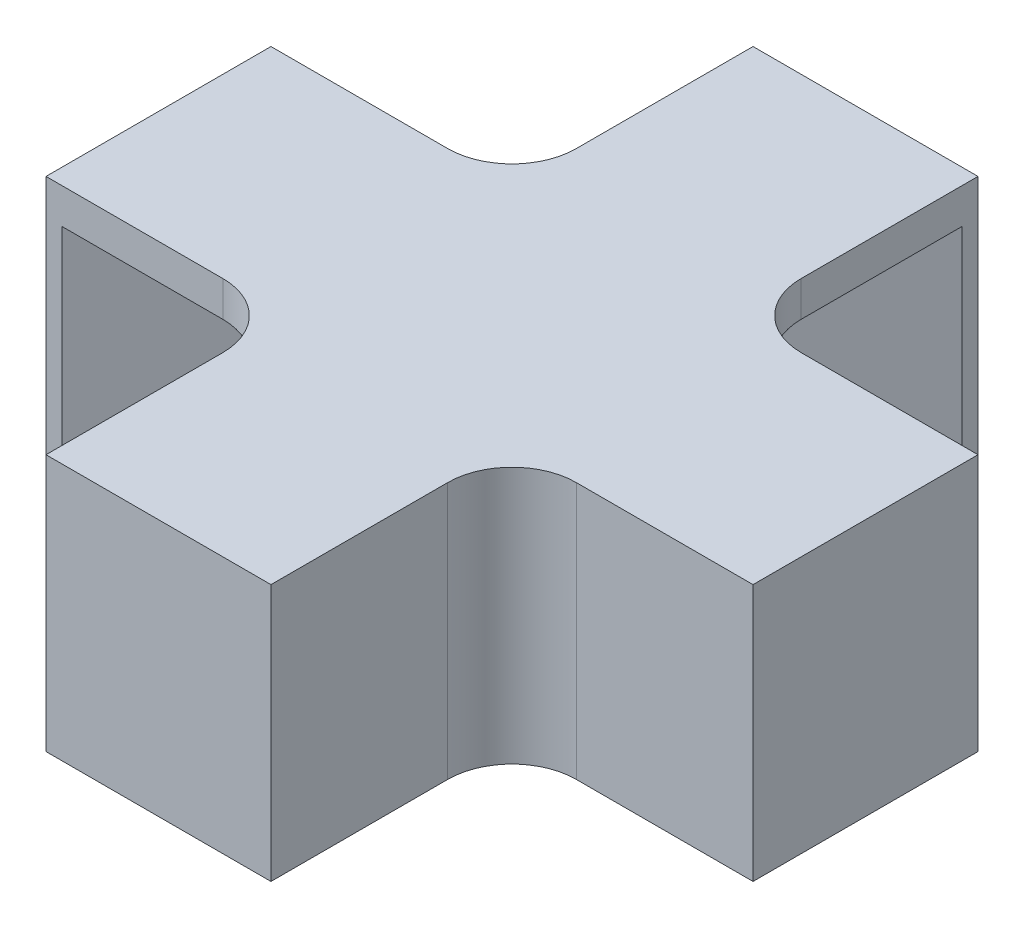
ISO-10303-21;
HEADER;
FILE_DESCRIPTION(('STEP AP214'),'2;1');
FILE_NAME('part.step','',(''),(''),'','','');
FILE_SCHEMA(('AUTOMOTIVE_DESIGN { 1 0 10303 214 1 1 1 1 }'));
ENDSEC;
DATA;
#1=APPLICATION_CONTEXT('core data for automotive mechanical design processes');
#2=APPLICATION_PROTOCOL_DEFINITION('international standard','automotive_design',2000,#1);
#3=PRODUCT_CONTEXT('',#1,'mechanical');
#4=PRODUCT('Part','Part','',(#3));
#5=PRODUCT_RELATED_PRODUCT_CATEGORY('part','',(#4));
#6=PRODUCT_DEFINITION_FORMATION('','',#4);
#7=PRODUCT_DEFINITION_CONTEXT('part definition',#1,'design');
#8=PRODUCT_DEFINITION('design','',#6,#7);
#9=PRODUCT_DEFINITION_SHAPE('','',#8);
#10=(LENGTH_UNIT() NAMED_UNIT(*) SI_UNIT(.MILLI.,.METRE.));
#11=(NAMED_UNIT(*) PLANE_ANGLE_UNIT() SI_UNIT($,.RADIAN.));
#12=(NAMED_UNIT(*) SI_UNIT($,.STERADIAN.) SOLID_ANGLE_UNIT());
#13=UNCERTAINTY_MEASURE_WITH_UNIT(LENGTH_MEASURE(1.E-05),#10,'distance_accuracy_value','');
#14=(GEOMETRIC_REPRESENTATION_CONTEXT(3) GLOBAL_UNCERTAINTY_ASSIGNED_CONTEXT((#13)) GLOBAL_UNIT_ASSIGNED_CONTEXT((#10,
#11,#12)) REPRESENTATION_CONTEXT('',''));
#15=CARTESIAN_POINT('',(0.,0.,0.));
#16=DIRECTION('',(0.,0.,1.));
#17=DIRECTION('',(1.,0.,0.));
#18=AXIS2_PLACEMENT_3D('',#15,#16,#17);
#19=CARTESIAN_POINT('',(-35.1963565550312,40.,0.));
#20=DIRECTION('',(1.,0.,0.));
#21=DIRECTION('',(0.,0.,-1.));
#22=AXIS2_PLACEMENT_3D('',#19,#20,#21);
#23=PLANE('',#22);
#24=DIRECTION('',(0.,0.,1.));
#25=VECTOR('',#24,1.);
#26=CARTESIAN_POINT('',(-35.1963565550312,34.5,0.));
#27=LINE('',#26,#25);
#28=CARTESIAN_POINT('',(-35.1963565550312,34.5,-65.3254131006446));
#29=VERTEX_POINT('',#28);
#30=CARTESIAN_POINT('',(-35.1963565550312,34.5,-40.3236274319105));
#31=VERTEX_POINT('',#30);
#32=EDGE_CURVE('E372',#29,#31,#27,.T.);
#33=ORIENTED_EDGE('',*,*,#32,.F.);
#34=DIRECTION('',(0.,-1.,0.));
#35=VECTOR('',#34,1.);
#36=CARTESIAN_POINT('',(-35.1963565550312,34.5,-65.3254131006446));
#37=LINE('',#36,#35);
#38=CARTESIAN_POINT('',(-35.1963565550312,0.,-65.3254131006446));
#39=VERTEX_POINT('',#38);
#40=EDGE_CURVE('E365',#29,#39,#37,.T.);
#41=ORIENTED_EDGE('',*,*,#40,.T.);
#42=DIRECTION('',(0.,0.,1.));
#43=VECTOR('',#42,1.);
#44=CARTESIAN_POINT('',(-35.1963565550312,0.,0.));
#45=LINE('',#44,#43);
#46=CARTESIAN_POINT('',(-35.1963565550312,0.,-67.8236274319104));
#47=VERTEX_POINT('',#46);
#48=EDGE_CURVE('E214',#47,#39,#45,.T.);
#49=ORIENTED_EDGE('',*,*,#48,.F.);
#50=DIRECTION('',(0.,-1.,0.));
#51=VECTOR('',#50,1.);
#52=CARTESIAN_POINT('',(-35.1963565550312,40.,-67.8236274319104));
#53=LINE('',#52,#51);
#54=CARTESIAN_POINT('',(-35.1963565550312,40.,-67.8236274319104));
#55=VERTEX_POINT('',#54);
#56=EDGE_CURVE('E303',#55,#47,#53,.T.);
#57=ORIENTED_EDGE('',*,*,#56,.F.);
#58=DIRECTION('',(0.,0.,1.));
#59=VECTOR('',#58,1.);
#60=CARTESIAN_POINT('',(-35.1963565550312,40.,0.));
#61=LINE('',#60,#59);
#62=CARTESIAN_POINT('',(-35.1963565550312,40.,-40.3236274319105));
#63=VERTEX_POINT('',#62);
#64=EDGE_CURVE('E385',#55,#63,#61,.T.);
#65=ORIENTED_EDGE('',*,*,#64,.T.);
#66=DIRECTION('',(0.,-1.,0.));
#67=VECTOR('',#66,1.);
#68=CARTESIAN_POINT('',(-35.1963565550312,40.,-40.3236274319105));
#69=LINE('',#68,#67);
#70=EDGE_CURVE('E306',#63,#31,#69,.T.);
#71=ORIENTED_EDGE('',*,*,#70,.T.);
#72=EDGE_LOOP('',(#33,#41,#49,#57,#65,#71));
#73=FACE_BOUND('',#72,.T.);
#74=ADVANCED_FACE('F45',(#73),#23,.T.);
#75=CARTESIAN_POINT('',(0.,40.,4.67637256808958));
#76=DIRECTION('',(0.,0.,-1.));
#77=DIRECTION('',(-1.,0.,0.));
#78=AXIS2_PLACEMENT_3D('',#75,#76,#77);
#79=PLANE('',#78);
#80=DIRECTION('',(0.,-1.,0.));
#81=VECTOR('',#80,1.);
#82=CARTESIAN_POINT('',(-105.198142223765,34.5,4.67637256808958));
#83=LINE('',#82,#81);
#84=CARTESIAN_POINT('',(-105.198142223765,34.5,4.67637256808958));
#85=VERTEX_POINT('',#84);
#86=CARTESIAN_POINT('',(-105.198142223765,0.,4.67637256808958));
#87=VERTEX_POINT('',#86);
#88=EDGE_CURVE('E357',#85,#87,#83,.T.);
#89=ORIENTED_EDGE('',*,*,#88,.F.);
#90=DIRECTION('',(1.,0.,0.));
#91=VECTOR('',#90,1.);
#92=CARTESIAN_POINT('',(0.,34.5,4.67637256808958));
#93=LINE('',#92,#91);
#94=CARTESIAN_POINT('',(-80.1963565550312,34.5,4.67637256808958));
#95=VERTEX_POINT('',#94);
#96=EDGE_CURVE('E501',#85,#95,#93,.T.);
#97=ORIENTED_EDGE('',*,*,#96,.T.);
#98=DIRECTION('',(0.,-1.,0.));
#99=VECTOR('',#98,1.);
#100=CARTESIAN_POINT('',(-80.1963565550312,40.,4.67637256808958));
#101=LINE('',#100,#99);
#102=CARTESIAN_POINT('',(-80.1963565550312,40.,4.67637256808958));
#103=VERTEX_POINT('',#102);
#104=EDGE_CURVE('E280',#103,#95,#101,.T.);
#105=ORIENTED_EDGE('',*,*,#104,.F.);
#106=DIRECTION('',(1.,0.,0.));
#107=VECTOR('',#106,1.);
#108=CARTESIAN_POINT('',(0.,40.,4.67637256808958));
#109=LINE('',#108,#107);
#110=CARTESIAN_POINT('',(-107.696356555031,40.,4.67637256808958));
#111=VERTEX_POINT('',#110);
#112=EDGE_CURVE('E405',#111,#103,#109,.T.);
#113=ORIENTED_EDGE('',*,*,#112,.F.);
#114=DIRECTION('',(0.,-1.,0.));
#115=VECTOR('',#114,1.);
#116=CARTESIAN_POINT('',(-107.696356555031,40.,4.67637256808958));
#117=LINE('',#116,#115);
#118=CARTESIAN_POINT('',(-107.696356555031,0.,4.67637256808958));
#119=VERTEX_POINT('',#118);
#120=EDGE_CURVE('E284',#111,#119,#117,.T.);
#121=ORIENTED_EDGE('',*,*,#120,.T.);
#122=DIRECTION('',(1.,0.,0.));
#123=VECTOR('',#122,1.);
#124=CARTESIAN_POINT('',(0.,0.,4.67637256808958));
#125=LINE('',#124,#123);
#126=EDGE_CURVE('E234',#119,#87,#125,.T.);
#127=ORIENTED_EDGE('',*,*,#126,.T.);
#128=EDGE_LOOP('',(#89,#97,#105,#113,#121,#127));
#129=FACE_BOUND('',#128,.T.);
#130=ADVANCED_FACE('F435',(#129),#79,.F.);
#131=CARTESIAN_POINT('',(0.,0.,0.));
#132=DIRECTION('',(0.,1.,0.));
#133=DIRECTION('',(0.,0.,1.));
#134=AXIS2_PLACEMENT_3D('',#131,#132,#133);
#135=PLANE('',#134);
#136=DIRECTION('',(-0.707106781186546,0.,0.707106781186549));
#137=VECTOR('',#136,1.);
#138=CARTESIAN_POINT('',(-50.260884827838,0.,-50.2608848278378));
#139=LINE('',#138,#137);
#140=EDGE_CURVE('E511',#39,#87,#139,.T.);
#141=ORIENTED_EDGE('',*,*,#140,.T.);
#142=ORIENTED_EDGE('',*,*,#126,.F.);
#143=DIRECTION('',(0.,0.,1.));
#144=VECTOR('',#143,1.);
#145=CARTESIAN_POINT('',(-107.696356555031,0.,0.));
#146=LINE('',#145,#144);
#147=CARTESIAN_POINT('',(-107.696356555031,0.,-30.3236274319104));
#148=VERTEX_POINT('',#147);
#149=EDGE_CURVE('E231',#148,#119,#146,.T.);
#150=ORIENTED_EDGE('',*,*,#149,.F.);
#151=DIRECTION('',(-1.,0.,0.));
#152=VECTOR('',#151,1.);
#153=CARTESIAN_POINT('',(0.,0.,-30.3236274319104));
#154=LINE('',#153,#152);
#155=CARTESIAN_POINT('',(-80.1963565550312,0.,-30.3236274319104));
#156=VERTEX_POINT('',#155);
#157=EDGE_CURVE('E228',#156,#148,#154,.T.);
#158=ORIENTED_EDGE('',*,*,#157,.F.);
#159=CARTESIAN_POINT('',(-80.1963565550312,0.,-40.3236274319104));
#160=DIRECTION('',(0.,1.,0.));
#161=DIRECTION('',(0.,0.,1.));
#162=AXIS2_PLACEMENT_3D('',#159,#160,#161);
#163=CIRCLE('',#162,10.);
#164=CARTESIAN_POINT('',(-70.1963565550312,0.,-40.3236274319105));
#165=VERTEX_POINT('',#164);
#166=EDGE_CURVE('E225',#165,#156,#163,.F.);
#167=ORIENTED_EDGE('',*,*,#166,.F.);
#168=DIRECTION('',(0.,0.,1.));
#169=VECTOR('',#168,1.);
#170=CARTESIAN_POINT('',(-70.1963565550312,0.,0.));
#171=LINE('',#170,#169);
#172=CARTESIAN_POINT('',(-70.1963565550312,0.,-67.8236274319104));
#173=VERTEX_POINT('',#172);
#174=EDGE_CURVE('E222',#173,#165,#171,.T.);
#175=ORIENTED_EDGE('',*,*,#174,.F.);
#176=DIRECTION('',(1.,0.,0.));
#177=VECTOR('',#176,1.);
#178=CARTESIAN_POINT('',(0.,0.,-67.8236274319104));
#179=LINE('',#178,#177);
#180=EDGE_CURVE('E218',#173,#47,#179,.T.);
#181=ORIENTED_EDGE('',*,*,#180,.T.);
#182=ORIENTED_EDGE('',*,*,#48,.T.);
#183=EDGE_LOOP('',(#141,#142,#150,#158,#167,#175,#181,#182));
#184=FACE_BOUND('',#183,.T.);
#185=ADVANCED_FACE('F441',(#184),#135,.F.);
#186=CARTESIAN_POINT('',(-15.2590991591037,40.,-15.259099159104));
#187=DIRECTION('',(-0.707106781186542,0.,-0.707106781186553));
#188=DIRECTION('',(-0.707106781186553,0.,0.707106781186542));
#189=AXIS2_PLACEMENT_3D('',#186,#187,#188);
#190=PLANE('',#189);
#191=DIRECTION('',(0.707106781186553,0.,-0.707106781186542));
#192=VECTOR('',#191,1.);
#193=CARTESIAN_POINT('',(-15.2590991591037,0.,-15.259099159104));
#194=LINE('',#193,#192);
#195=CARTESIAN_POINT('',(-70.1963565550312,0.,39.6781582368238));
#196=VERTEX_POINT('',#195);
#197=CARTESIAN_POINT('',(-0.194570886297066,0.,-30.3236274319104));
#198=VERTEX_POINT('',#197);
#199=EDGE_CURVE('E63',#196,#198,#194,.T.);
#200=ORIENTED_EDGE('',*,*,#199,.F.);
#201=DIRECTION('',(0.,-1.,0.));
#202=VECTOR('',#201,1.);
#203=CARTESIAN_POINT('',(-70.1963565550312,34.5,39.6781582368238));
#204=LINE('',#203,#202);
#205=CARTESIAN_POINT('',(-70.1963565550312,34.5,39.6781582368238));
#206=VERTEX_POINT('',#205);
#207=EDGE_CURVE('E349',#206,#196,#204,.T.);
#208=ORIENTED_EDGE('',*,*,#207,.F.);
#209=DIRECTION('',(-0.707106781186546,0.,0.707106781186549));
#210=VECTOR('',#209,1.);
#211=CARTESIAN_POINT('',(-15.2590991591038,34.5,-15.2590991591038));
#212=LINE('',#211,#210);
#213=CARTESIAN_POINT('',(-35.1963565550312,34.5,4.67815823682369));
#214=VERTEX_POINT('',#213);
#215=EDGE_CURVE('E183',#214,#206,#212,.T.);
#216=ORIENTED_EDGE('',*,*,#215,.F.);
#217=DIRECTION('',(0.,-1.,0.));
#218=VECTOR('',#217,1.);
#219=CARTESIAN_POINT('',(-35.1963565550313,40.,4.67815823682354));
#220=LINE('',#219,#218);
#221=CARTESIAN_POINT('',(-35.1963565550313,40.,4.67815823682354));
#222=VERTEX_POINT('',#221);
#223=EDGE_CURVE('E11',#222,#214,#220,.T.);
#224=ORIENTED_EDGE('',*,*,#223,.F.);
#225=DIRECTION('',(0.707106781186553,0.,-0.707106781186542));
#226=VECTOR('',#225,1.);
#227=CARTESIAN_POINT('',(-15.2590991591037,40.,-15.259099159104));
#228=LINE('',#227,#226);
#229=CARTESIAN_POINT('',(-35.1945708862972,40.,4.67637256808945));
#230=VERTEX_POINT('',#229);
#231=EDGE_CURVE('E178',#222,#230,#228,.T.);
#232=ORIENTED_EDGE('',*,*,#231,.T.);
#233=DIRECTION('',(0.,-1.,0.));
#234=VECTOR('',#233,1.);
#235=CARTESIAN_POINT('',(-35.1945708862972,40.,4.67637256808945));
#236=LINE('',#235,#234);
#237=CARTESIAN_POINT('',(-35.1945708862971,34.5,4.67637256808959));
#238=VERTEX_POINT('',#237);
#239=EDGE_CURVE('E72',#230,#238,#236,.T.);
#240=ORIENTED_EDGE('',*,*,#239,.T.);
#241=CARTESIAN_POINT('',(-0.194570886297066,34.5,-30.3236274319104));
#242=VERTEX_POINT('',#241);
#243=EDGE_CURVE('E485',#242,#238,#212,.T.);
#244=ORIENTED_EDGE('',*,*,#243,.F.);
#245=DIRECTION('',(0.,-1.,0.));
#246=VECTOR('',#245,1.);
#247=CARTESIAN_POINT('',(-0.194570886297066,34.5,-30.3236274319104));
#248=LINE('',#247,#246);
#249=EDGE_CURVE('E358',#242,#198,#248,.T.);
#250=ORIENTED_EDGE('',*,*,#249,.T.);
#251=EDGE_LOOP('',(#200,#208,#216,#224,#232,#240,#244,#250));
#252=FACE_BOUND('',#251,.T.);
#253=ADVANCED_FACE('F177',(#252),#190,.T.);
#254=CARTESIAN_POINT('',(-35.1963565550493,40.,1.36768807828285E-10));
#255=DIRECTION('',(1.,0.,-3.88587971071295E-12));
#256=DIRECTION('',(-3.88587971071295E-12,0.,-1.));
#257=AXIS2_PLACEMENT_3D('',#254,#255,#256);
#258=PLANE('',#257);
#259=DIRECTION('',(3.88587971071295E-12,0.,1.));
#260=VECTOR('',#259,1.);
#261=CARTESIAN_POINT('',(-35.1963565550493,34.5,1.36768807828285E-10));
#262=LINE('',#261,#260);
#263=CARTESIAN_POINT('',(-35.1963565550312,34.5,4.67637256808958));
#264=VERTEX_POINT('',#263);
#265=EDGE_CURVE('E494',#264,#214,#262,.T.);
#266=ORIENTED_EDGE('',*,*,#265,.F.);
#267=DIRECTION('',(0.,-1.,0.));
#268=VECTOR('',#267,1.);
#269=CARTESIAN_POINT('',(-35.1963565550312,40.,4.67637256808958));
#270=LINE('',#269,#268);
#271=CARTESIAN_POINT('',(-35.1963565550312,40.,4.67637256808958));
#272=VERTEX_POINT('',#271);
#273=EDGE_CURVE('E55',#272,#264,#270,.T.);
#274=ORIENTED_EDGE('',*,*,#273,.F.);
#275=DIRECTION('',(3.88587971071295E-12,0.,1.));
#276=VECTOR('',#275,1.);
#277=CARTESIAN_POINT('',(-35.1963565550493,40.,1.36768807828285E-10));
#278=LINE('',#277,#276);
#279=EDGE_CURVE('E191',#272,#222,#278,.T.);
#280=ORIENTED_EDGE('',*,*,#279,.T.);
#281=ORIENTED_EDGE('',*,*,#223,.T.);
#282=EDGE_LOOP('',(#266,#274,#280,#281));
#283=FACE_BOUND('',#282,.T.);
#284=ADVANCED_FACE('F196',(#283),#258,.T.);
#285=CARTESIAN_POINT('',(2.30364344496883,40.,0.));
#286=DIRECTION('',(-1.,0.,0.));
#287=DIRECTION('',(0.,0.,1.));
#288=AXIS2_PLACEMENT_3D('',#285,#286,#287);
#289=PLANE('',#288);
#290=DIRECTION('',(0.,0.,-1.));
#291=VECTOR('',#290,1.);
#292=CARTESIAN_POINT('',(2.30364344496883,0.,0.));
#293=LINE('',#292,#291);
#294=CARTESIAN_POINT('',(2.30364344496883,0.,4.67637256808958));
#295=VERTEX_POINT('',#294);
#296=CARTESIAN_POINT('',(2.30364344496883,0.,-30.3236274319104));
#297=VERTEX_POINT('',#296);
#298=EDGE_CURVE('E205',#295,#297,#293,.T.);
#299=ORIENTED_EDGE('',*,*,#298,.T.);
#300=DIRECTION('',(0.,-1.,0.));
#301=VECTOR('',#300,1.);
#302=CARTESIAN_POINT('',(2.30364344496883,40.,-30.3236274319104));
#303=LINE('',#302,#301);
#304=CARTESIAN_POINT('',(2.30364344496883,40.,-30.3236274319104));
#305=VERTEX_POINT('',#304);
#306=EDGE_CURVE('E49',#305,#297,#303,.T.);
#307=ORIENTED_EDGE('',*,*,#306,.F.);
#308=DIRECTION('',(0.,0.,-1.));
#309=VECTOR('',#308,1.);
#310=CARTESIAN_POINT('',(2.30364344496883,40.,0.));
#311=LINE('',#310,#309);
#312=CARTESIAN_POINT('',(2.30364344496883,40.,4.67637256808958));
#313=VERTEX_POINT('',#312);
#314=EDGE_CURVE('E257',#313,#305,#311,.T.);
#315=ORIENTED_EDGE('',*,*,#314,.F.);
#316=DIRECTION('',(0.,-1.,0.));
#317=VECTOR('',#316,1.);
#318=CARTESIAN_POINT('',(2.30364344496883,40.,4.67637256808958));
#319=LINE('',#318,#317);
#320=EDGE_CURVE('E201',#313,#295,#319,.T.);
#321=ORIENTED_EDGE('',*,*,#320,.T.);
#322=EDGE_LOOP('',(#299,#307,#315,#321));
#323=FACE_BOUND('',#322,.T.);
#324=ADVANCED_FACE('F47',(#323),#289,.F.);
#325=CARTESIAN_POINT('',(0.,40.,-30.3236274319104));
#326=DIRECTION('',(0.,0.,1.));
#327=DIRECTION('',(1.,0.,0.));
#328=AXIS2_PLACEMENT_3D('',#325,#326,#327);
#329=PLANE('',#328);
#330=DIRECTION('',(-1.,0.,0.));
#331=VECTOR('',#330,1.);
#332=CARTESIAN_POINT('',(0.,0.,-30.3236274319104));
#333=LINE('',#332,#331);
#334=EDGE_CURVE('E209',#297,#198,#333,.T.);
#335=ORIENTED_EDGE('',*,*,#334,.T.);
#336=ORIENTED_EDGE('',*,*,#249,.F.);
#337=DIRECTION('',(-1.,0.,0.));
#338=VECTOR('',#337,1.);
#339=CARTESIAN_POINT('',(0.,34.5,-30.3236274319104));
#340=LINE('',#339,#338);
#341=CARTESIAN_POINT('',(-25.1963565550312,34.5,-30.3236274319104));
#342=VERTEX_POINT('',#341);
#343=EDGE_CURVE('E481',#242,#342,#340,.T.);
#344=ORIENTED_EDGE('',*,*,#343,.T.);
#345=DIRECTION('',(0.,-1.,0.));
#346=VECTOR('',#345,1.);
#347=CARTESIAN_POINT('',(-25.1963565550311,40.,-30.3236274319104));
#348=LINE('',#347,#346);
#349=CARTESIAN_POINT('',(-25.1963565550311,40.,-30.3236274319104));
#350=VERTEX_POINT('',#349);
#351=EDGE_CURVE('E309',#350,#342,#348,.T.);
#352=ORIENTED_EDGE('',*,*,#351,.F.);
#353=DIRECTION('',(-1.,0.,0.));
#354=VECTOR('',#353,1.);
#355=CARTESIAN_POINT('',(0.,40.,-30.3236274319104));
#356=LINE('',#355,#354);
#357=EDGE_CURVE('E126',#305,#350,#356,.T.);
#358=ORIENTED_EDGE('',*,*,#357,.F.);
#359=ORIENTED_EDGE('',*,*,#306,.T.);
#360=EDGE_LOOP('',(#335,#336,#344,#352,#358,#359));
#361=FACE_BOUND('',#360,.T.);
#362=ADVANCED_FACE('F317',(#361),#329,.F.);
#363=CARTESIAN_POINT('',(-25.1963565550312,40.,-40.3236274319104));
#364=DIRECTION('',(0.,-1.,0.));
#365=DIRECTION('',(0.,0.,-1.));
#366=AXIS2_PLACEMENT_3D('',#363,#364,#365);
#367=CYLINDRICAL_SURFACE('',#366,10.);
#368=ORIENTED_EDGE('',*,*,#351,.T.);
#369=CARTESIAN_POINT('',(-25.1963565550312,34.5,-40.3236274319104));
#370=DIRECTION('',(0.,1.,0.));
#371=DIRECTION('',(0.,0.,1.));
#372=AXIS2_PLACEMENT_3D('',#369,#370,#371);
#373=CIRCLE('',#372,10.);
#374=EDGE_CURVE('E210',#342,#31,#373,.F.);
#375=ORIENTED_EDGE('',*,*,#374,.T.);
#376=ORIENTED_EDGE('',*,*,#70,.F.);
#377=CARTESIAN_POINT('',(-25.1963565550312,40.,-40.3236274319104));
#378=DIRECTION('',(0.,1.,0.));
#379=DIRECTION('',(0.,0.,1.));
#380=AXIS2_PLACEMENT_3D('',#377,#378,#379);
#381=CIRCLE('',#380,10.);
#382=EDGE_CURVE('E382',#350,#63,#381,.F.);
#383=ORIENTED_EDGE('',*,*,#382,.F.);
#384=EDGE_LOOP('',(#368,#375,#376,#383));
#385=FACE_BOUND('',#384,.T.);
#386=ADVANCED_FACE('F449',(#385),#367,.F.);
#387=CARTESIAN_POINT('',(0.,40.,-67.8236274319104));
#388=DIRECTION('',(0.,0.,-1.));
#389=DIRECTION('',(-1.,0.,0.));
#390=AXIS2_PLACEMENT_3D('',#387,#388,#389);
#391=PLANE('',#390);
#392=ORIENTED_EDGE('',*,*,#180,.F.);
#393=DIRECTION('',(0.,-1.,0.));
#394=VECTOR('',#393,1.);
#395=CARTESIAN_POINT('',(-70.1963565550312,40.,-67.8236274319104));
#396=LINE('',#395,#394);
#397=CARTESIAN_POINT('',(-70.1963565550312,40.,-67.8236274319104));
#398=VERTEX_POINT('',#397);
#399=EDGE_CURVE('E300',#398,#173,#396,.T.);
#400=ORIENTED_EDGE('',*,*,#399,.F.);
#401=DIRECTION('',(1.,0.,0.));
#402=VECTOR('',#401,1.);
#403=CARTESIAN_POINT('',(0.,40.,-67.8236274319104));
#404=LINE('',#403,#402);
#405=EDGE_CURVE('E389',#398,#55,#404,.T.);
#406=ORIENTED_EDGE('',*,*,#405,.T.);
#407=ORIENTED_EDGE('',*,*,#56,.T.);
#408=EDGE_LOOP('',(#392,#400,#406,#407));
#409=FACE_BOUND('',#408,.T.);
#410=ADVANCED_FACE('F447',(#409),#391,.T.);
#411=CARTESIAN_POINT('',(-70.1963565550312,40.,0.));
#412=DIRECTION('',(1.,0.,0.));
#413=DIRECTION('',(0.,0.,-1.));
#414=AXIS2_PLACEMENT_3D('',#411,#412,#413);
#415=PLANE('',#414);
#416=ORIENTED_EDGE('',*,*,#174,.T.);
#417=DIRECTION('',(0.,-1.,0.));
#418=VECTOR('',#417,1.);
#419=CARTESIAN_POINT('',(-70.1963565550312,40.,-40.3236274319105));
#420=LINE('',#419,#418);
#421=CARTESIAN_POINT('',(-70.1963565550312,40.,-40.3236274319105));
#422=VERTEX_POINT('',#421);
#423=EDGE_CURVE('E296',#422,#165,#420,.T.);
#424=ORIENTED_EDGE('',*,*,#423,.F.);
#425=DIRECTION('',(0.,0.,1.));
#426=VECTOR('',#425,1.);
#427=CARTESIAN_POINT('',(-70.1963565550312,40.,0.));
#428=LINE('',#427,#426);
#429=EDGE_CURVE('E393',#398,#422,#428,.T.);
#430=ORIENTED_EDGE('',*,*,#429,.F.);
#431=ORIENTED_EDGE('',*,*,#399,.T.);
#432=EDGE_LOOP('',(#416,#424,#430,#431));
#433=FACE_BOUND('',#432,.T.);
#434=ADVANCED_FACE('F566',(#433),#415,.F.);
#435=CARTESIAN_POINT('',(-80.1963565550312,40.,-40.3236274319104));
#436=DIRECTION('',(0.,-1.,0.));
#437=DIRECTION('',(0.,0.,-1.));
#438=AXIS2_PLACEMENT_3D('',#435,#436,#437);
#439=CYLINDRICAL_SURFACE('',#438,10.);
#440=ORIENTED_EDGE('',*,*,#166,.T.);
#441=DIRECTION('',(0.,-1.,0.));
#442=VECTOR('',#441,1.);
#443=CARTESIAN_POINT('',(-80.1963565550312,40.,-30.3236274319104));
#444=LINE('',#443,#442);
#445=CARTESIAN_POINT('',(-80.1963565550312,40.,-30.3236274319104));
#446=VERTEX_POINT('',#445);
#447=EDGE_CURVE('E292',#446,#156,#444,.T.);
#448=ORIENTED_EDGE('',*,*,#447,.F.);
#449=CARTESIAN_POINT('',(-80.1963565550312,40.,-40.3236274319104));
#450=DIRECTION('',(0.,1.,0.));
#451=DIRECTION('',(0.,0.,1.));
#452=AXIS2_PLACEMENT_3D('',#449,#450,#451);
#453=CIRCLE('',#452,10.);
#454=EDGE_CURVE('E396',#422,#446,#453,.F.);
#455=ORIENTED_EDGE('',*,*,#454,.F.);
#456=ORIENTED_EDGE('',*,*,#423,.T.);
#457=EDGE_LOOP('',(#440,#448,#455,#456));
#458=FACE_BOUND('',#457,.T.);
#459=ADVANCED_FACE('F563',(#458),#439,.F.);
#460=CARTESIAN_POINT('',(0.,40.,-30.3236274319104));
#461=DIRECTION('',(0.,0.,1.));
#462=DIRECTION('',(1.,0.,0.));
#463=AXIS2_PLACEMENT_3D('',#460,#461,#462);
#464=PLANE('',#463);
#465=ORIENTED_EDGE('',*,*,#157,.T.);
#466=DIRECTION('',(0.,-1.,0.));
#467=VECTOR('',#466,1.);
#468=CARTESIAN_POINT('',(-107.696356555031,40.,-30.3236274319104));
#469=LINE('',#468,#467);
#470=CARTESIAN_POINT('',(-107.696356555031,40.,-30.3236274319104));
#471=VERTEX_POINT('',#470);
#472=EDGE_CURVE('E288',#471,#148,#469,.T.);
#473=ORIENTED_EDGE('',*,*,#472,.F.);
#474=DIRECTION('',(-1.,0.,0.));
#475=VECTOR('',#474,1.);
#476=CARTESIAN_POINT('',(0.,40.,-30.3236274319104));
#477=LINE('',#476,#475);
#478=EDGE_CURVE('E399',#446,#471,#477,.T.);
#479=ORIENTED_EDGE('',*,*,#478,.F.);
#480=ORIENTED_EDGE('',*,*,#447,.T.);
#481=EDGE_LOOP('',(#465,#473,#479,#480));
#482=FACE_BOUND('',#481,.T.);
#483=ADVANCED_FACE('F559',(#482),#464,.F.);
#484=CARTESIAN_POINT('',(-107.696356555031,40.,0.));
#485=DIRECTION('',(1.,0.,0.));
#486=DIRECTION('',(0.,0.,-1.));
#487=AXIS2_PLACEMENT_3D('',#484,#485,#486);
#488=PLANE('',#487);
#489=ORIENTED_EDGE('',*,*,#149,.T.);
#490=ORIENTED_EDGE('',*,*,#120,.F.);
#491=DIRECTION('',(0.,0.,1.));
#492=VECTOR('',#491,1.);
#493=CARTESIAN_POINT('',(-107.696356555031,40.,0.));
#494=LINE('',#493,#492);
#495=EDGE_CURVE('E402',#471,#111,#494,.T.);
#496=ORIENTED_EDGE('',*,*,#495,.F.);
#497=ORIENTED_EDGE('',*,*,#472,.T.);
#498=EDGE_LOOP('',(#489,#490,#496,#497));
#499=FACE_BOUND('',#498,.T.);
#500=ADVANCED_FACE('F554',(#499),#488,.F.);
#501=CARTESIAN_POINT('',(-80.1963565550312,40.,14.6763725680896));
#502=DIRECTION('',(0.,-1.,0.));
#503=DIRECTION('',(0.,0.,-1.));
#504=AXIS2_PLACEMENT_3D('',#501,#502,#503);
#505=CYLINDRICAL_SURFACE('',#504,10.);
#506=ORIENTED_EDGE('',*,*,#104,.T.);
#507=CARTESIAN_POINT('',(-80.1963565550312,34.5,14.6763725680896));
#508=DIRECTION('',(0.,1.,0.));
#509=DIRECTION('',(0.,0.,1.));
#510=AXIS2_PLACEMENT_3D('',#507,#508,#509);
#511=CIRCLE('',#510,10.);
#512=CARTESIAN_POINT('',(-70.1963565550312,34.5,14.6763725680896));
#513=VERTEX_POINT('',#512);
#514=EDGE_CURVE('E363',#95,#513,#511,.F.);
#515=ORIENTED_EDGE('',*,*,#514,.T.);
#516=DIRECTION('',(0.,-1.,0.));
#517=VECTOR('',#516,1.);
#518=CARTESIAN_POINT('',(-70.1963565550312,40.,14.6763725680896));
#519=LINE('',#518,#517);
#520=CARTESIAN_POINT('',(-70.1963565550312,40.,14.6763725680896));
#521=VERTEX_POINT('',#520);
#522=EDGE_CURVE('E276',#521,#513,#519,.T.);
#523=ORIENTED_EDGE('',*,*,#522,.F.);
#524=CARTESIAN_POINT('',(-80.1963565550312,40.,14.6763725680896));
#525=DIRECTION('',(0.,1.,0.));
#526=DIRECTION('',(0.,0.,1.));
#527=AXIS2_PLACEMENT_3D('',#524,#525,#526);
#528=CIRCLE('',#527,10.);
#529=EDGE_CURVE('E408',#103,#521,#528,.F.);
#530=ORIENTED_EDGE('',*,*,#529,.F.);
#531=EDGE_LOOP('',(#506,#515,#523,#530));
#532=FACE_BOUND('',#531,.T.);
#533=ADVANCED_FACE('F569',(#532),#505,.F.);
#534=CARTESIAN_POINT('',(-70.1963565550312,40.,0.));
#535=DIRECTION('',(-1.,0.,0.));
#536=DIRECTION('',(0.,0.,1.));
#537=AXIS2_PLACEMENT_3D('',#534,#535,#536);
#538=PLANE('',#537);
#539=ORIENTED_EDGE('',*,*,#207,.T.);
#540=DIRECTION('',(0.,0.,-1.));
#541=VECTOR('',#540,1.);
#542=CARTESIAN_POINT('',(-70.1963565550312,0.,0.));
#543=LINE('',#542,#541);
#544=CARTESIAN_POINT('',(-70.1963565550312,0.,42.1763725680896));
#545=VERTEX_POINT('',#544);
#546=EDGE_CURVE('E238',#545,#196,#543,.T.);
#547=ORIENTED_EDGE('',*,*,#546,.F.);
#548=DIRECTION('',(0.,-1.,0.));
#549=VECTOR('',#548,1.);
#550=CARTESIAN_POINT('',(-70.1963565550312,40.,42.1763725680896));
#551=LINE('',#550,#549);
#552=CARTESIAN_POINT('',(-70.1963565550312,40.,42.1763725680896));
#553=VERTEX_POINT('',#552);
#554=EDGE_CURVE('E273',#553,#545,#551,.T.);
#555=ORIENTED_EDGE('',*,*,#554,.F.);
#556=DIRECTION('',(0.,0.,-1.));
#557=VECTOR('',#556,1.);
#558=CARTESIAN_POINT('',(-70.1963565550312,40.,0.));
#559=LINE('',#558,#557);
#560=EDGE_CURVE('E411',#553,#521,#559,.T.);
#561=ORIENTED_EDGE('',*,*,#560,.T.);
#562=ORIENTED_EDGE('',*,*,#522,.T.);
#563=DIRECTION('',(0.,0.,-1.));
#564=VECTOR('',#563,1.);
#565=CARTESIAN_POINT('',(-70.1963565550312,34.5,0.));
#566=LINE('',#565,#564);
#567=EDGE_CURVE('E352',#206,#513,#566,.T.);
#568=ORIENTED_EDGE('',*,*,#567,.F.);
#569=EDGE_LOOP('',(#539,#547,#555,#561,#562,#568));
#570=FACE_BOUND('',#569,.T.);
#571=ADVANCED_FACE('F347',(#570),#538,.T.);
#572=CARTESIAN_POINT('',(0.,40.,42.1763725680896));
#573=DIRECTION('',(0.,0.,1.));
#574=DIRECTION('',(1.,0.,0.));
#575=AXIS2_PLACEMENT_3D('',#572,#573,#574);
#576=PLANE('',#575);
#577=DIRECTION('',(-1.,0.,0.));
#578=VECTOR('',#577,1.);
#579=CARTESIAN_POINT('',(0.,0.,42.1763725680896));
#580=LINE('',#579,#578);
#581=CARTESIAN_POINT('',(-35.1963565550312,0.,42.1763725680896));
#582=VERTEX_POINT('',#581);
#583=EDGE_CURVE('E241',#582,#545,#580,.T.);
#584=ORIENTED_EDGE('',*,*,#583,.F.);
#585=DIRECTION('',(0.,-1.,0.));
#586=VECTOR('',#585,1.);
#587=CARTESIAN_POINT('',(-35.1963565550312,40.,42.1763725680896));
#588=LINE('',#587,#586);
#589=CARTESIAN_POINT('',(-35.1963565550312,40.,42.1763725680896));
#590=VERTEX_POINT('',#589);
#591=EDGE_CURVE('E270',#590,#582,#588,.T.);
#592=ORIENTED_EDGE('',*,*,#591,.F.);
#593=DIRECTION('',(-1.,0.,0.));
#594=VECTOR('',#593,1.);
#595=CARTESIAN_POINT('',(0.,40.,42.1763725680896));
#596=LINE('',#595,#594);
#597=EDGE_CURVE('E342',#590,#553,#596,.T.);
#598=ORIENTED_EDGE('',*,*,#597,.T.);
#599=ORIENTED_EDGE('',*,*,#554,.T.);
#600=EDGE_LOOP('',(#584,#592,#598,#599));
#601=FACE_BOUND('',#600,.T.);
#602=ADVANCED_FACE('F339',(#601),#576,.T.);
#603=CARTESIAN_POINT('',(-35.1963565550312,40.,0.));
#604=DIRECTION('',(1.,0.,0.));
#605=DIRECTION('',(0.,0.,-1.));
#606=AXIS2_PLACEMENT_3D('',#603,#604,#605);
#607=PLANE('',#606);
#608=DIRECTION('',(0.,0.,1.));
#609=VECTOR('',#608,1.);
#610=CARTESIAN_POINT('',(-35.1963565550312,0.,0.));
#611=LINE('',#610,#609);
#612=CARTESIAN_POINT('',(-35.1963565550312,0.,14.6763725680897));
#613=VERTEX_POINT('',#612);
#614=EDGE_CURVE('E245',#613,#582,#611,.T.);
#615=ORIENTED_EDGE('',*,*,#614,.F.);
#616=DIRECTION('',(0.,-1.,0.));
#617=VECTOR('',#616,1.);
#618=CARTESIAN_POINT('',(-35.1963565550312,40.,14.6763725680897));
#619=LINE('',#618,#617);
#620=CARTESIAN_POINT('',(-35.1963565550312,40.,14.6763725680897));
#621=VERTEX_POINT('',#620);
#622=EDGE_CURVE('E267',#621,#613,#619,.T.);
#623=ORIENTED_EDGE('',*,*,#622,.F.);
#624=DIRECTION('',(0.,0.,1.));
#625=VECTOR('',#624,1.);
#626=CARTESIAN_POINT('',(-35.1963565550312,40.,0.));
#627=LINE('',#626,#625);
#628=EDGE_CURVE('E416',#621,#590,#627,.T.);
#629=ORIENTED_EDGE('',*,*,#628,.T.);
#630=ORIENTED_EDGE('',*,*,#591,.T.);
#631=EDGE_LOOP('',(#615,#623,#629,#630));
#632=FACE_BOUND('',#631,.T.);
#633=ADVANCED_FACE('F334',(#632),#607,.T.);
#634=CARTESIAN_POINT('',(-25.1963565550312,40.,14.6763725680896));
#635=DIRECTION('',(0.,-1.,0.));
#636=DIRECTION('',(0.,0.,-1.));
#637=AXIS2_PLACEMENT_3D('',#634,#635,#636);
#638=CYLINDRICAL_SURFACE('',#637,10.);
#639=CARTESIAN_POINT('',(-25.1963565550312,0.,14.6763725680896));
#640=DIRECTION('',(0.,1.,0.));
#641=DIRECTION('',(0.,0.,1.));
#642=AXIS2_PLACEMENT_3D('',#639,#640,#641);
#643=CIRCLE('',#642,10.);
#644=CARTESIAN_POINT('',(-25.1963565550311,0.,4.67637256808958));
#645=VERTEX_POINT('',#644);
#646=EDGE_CURVE('E249',#645,#613,#643,.T.);
#647=ORIENTED_EDGE('',*,*,#646,.F.);
#648=DIRECTION('',(0.,-1.,0.));
#649=VECTOR('',#648,1.);
#650=CARTESIAN_POINT('',(-25.1963565550311,40.,4.67637256808958));
#651=LINE('',#650,#649);
#652=CARTESIAN_POINT('',(-25.1963565550311,40.,4.67637256808958));
#653=VERTEX_POINT('',#652);
#654=EDGE_CURVE('E264',#653,#645,#651,.T.);
#655=ORIENTED_EDGE('',*,*,#654,.F.);
#656=CARTESIAN_POINT('',(-25.1963565550312,40.,14.6763725680896));
#657=DIRECTION('',(0.,1.,0.));
#658=DIRECTION('',(0.,0.,1.));
#659=AXIS2_PLACEMENT_3D('',#656,#657,#658);
#660=CIRCLE('',#659,10.);
#661=EDGE_CURVE('E330',#653,#621,#660,.T.);
#662=ORIENTED_EDGE('',*,*,#661,.T.);
#663=ORIENTED_EDGE('',*,*,#622,.T.);
#664=EDGE_LOOP('',(#647,#655,#662,#663));
#665=FACE_BOUND('',#664,.T.);
#666=ADVANCED_FACE('F325',(#665),#638,.F.);
#667=CARTESIAN_POINT('',(0.,40.,4.67637256808958));
#668=DIRECTION('',(0.,0.,-1.));
#669=DIRECTION('',(-1.,0.,0.));
#670=AXIS2_PLACEMENT_3D('',#667,#668,#669);
#671=PLANE('',#670);
#672=DIRECTION('',(1.,0.,0.));
#673=VECTOR('',#672,1.);
#674=CARTESIAN_POINT('',(0.,0.,4.67637256808958));
#675=LINE('',#674,#673);
#676=EDGE_CURVE('E117',#645,#295,#675,.T.);
#677=ORIENTED_EDGE('',*,*,#676,.T.);
#678=ORIENTED_EDGE('',*,*,#320,.F.);
#679=DIRECTION('',(1.,0.,0.));
#680=VECTOR('',#679,1.);
#681=CARTESIAN_POINT('',(0.,40.,4.67637256808958));
#682=LINE('',#681,#680);
#683=EDGE_CURVE('E194',#653,#313,#682,.T.);
#684=ORIENTED_EDGE('',*,*,#683,.F.);
#685=ORIENTED_EDGE('',*,*,#654,.T.);
#686=EDGE_LOOP('',(#677,#678,#684,#685));
#687=FACE_BOUND('',#686,.T.);
#688=ADVANCED_FACE('F422',(#687),#671,.F.);
#689=CARTESIAN_POINT('',(-9.08591064115217E-12,40.,4.67637256815797));
#690=DIRECTION('',(-1.9429398553527E-12,0.,1.));
#691=DIRECTION('',(1.,0.,1.9429398553527E-12));
#692=AXIS2_PLACEMENT_3D('',#689,#690,#691);
#693=PLANE('',#692);
#694=DIRECTION('',(-1.,0.,-1.9429398553527E-12));
#695=VECTOR('',#694,1.);
#696=CARTESIAN_POINT('',(-9.08591064115217E-12,34.5,4.67637256815797));
#697=LINE('',#696,#695);
#698=EDGE_CURVE('E491',#238,#264,#697,.T.);
#699=ORIENTED_EDGE('',*,*,#698,.F.);
#700=ORIENTED_EDGE('',*,*,#239,.F.);
#701=DIRECTION('',(-1.,0.,-1.9429398553527E-12));
#702=VECTOR('',#701,1.);
#703=CARTESIAN_POINT('',(-9.08591064115217E-12,40.,4.67637256815797));
#704=LINE('',#703,#702);
#705=EDGE_CURVE('E192',#230,#272,#704,.T.);
#706=ORIENTED_EDGE('',*,*,#705,.T.);
#707=ORIENTED_EDGE('',*,*,#273,.T.);
#708=EDGE_LOOP('',(#699,#700,#706,#707));
#709=FACE_BOUND('',#708,.T.);
#710=ADVANCED_FACE('F424',(#709),#693,.T.);
#711=CARTESIAN_POINT('',(0.,40.,0.));
#712=DIRECTION('',(0.,1.,0.));
#713=DIRECTION('',(0.,0.,1.));
#714=AXIS2_PLACEMENT_3D('',#711,#712,#713);
#715=PLANE('',#714);
#716=ORIENTED_EDGE('',*,*,#314,.T.);
#717=ORIENTED_EDGE('',*,*,#357,.T.);
#718=ORIENTED_EDGE('',*,*,#382,.T.);
#719=ORIENTED_EDGE('',*,*,#64,.F.);
#720=ORIENTED_EDGE('',*,*,#405,.F.);
#721=ORIENTED_EDGE('',*,*,#429,.T.);
#722=ORIENTED_EDGE('',*,*,#454,.T.);
#723=ORIENTED_EDGE('',*,*,#478,.T.);
#724=ORIENTED_EDGE('',*,*,#495,.T.);
#725=ORIENTED_EDGE('',*,*,#112,.T.);
#726=ORIENTED_EDGE('',*,*,#529,.T.);
#727=ORIENTED_EDGE('',*,*,#560,.F.);
#728=ORIENTED_EDGE('',*,*,#597,.F.);
#729=ORIENTED_EDGE('',*,*,#628,.F.);
#730=ORIENTED_EDGE('',*,*,#661,.F.);
#731=ORIENTED_EDGE('',*,*,#683,.T.);
#732=EDGE_LOOP('',(#716,#717,#718,#719,#720,#721,#722,#723,#724,#725,#726,#727,#728,#729,#730,#731));
#733=FACE_BOUND('',#732,.T.);
#734=ORIENTED_EDGE('',*,*,#231,.F.);
#735=ORIENTED_EDGE('',*,*,#279,.F.);
#736=ORIENTED_EDGE('',*,*,#705,.F.);
#737=EDGE_LOOP('',(#734,#735,#736));
#738=FACE_BOUND('',#737,.T.);
#739=ADVANCED_FACE('F190',(#733,#738),#715,.T.);
#740=ORIENTED_EDGE('',*,*,#546,.T.);
#741=ORIENTED_EDGE('',*,*,#199,.T.);
#742=ORIENTED_EDGE('',*,*,#334,.F.);
#743=ORIENTED_EDGE('',*,*,#298,.F.);
#744=ORIENTED_EDGE('',*,*,#676,.F.);
#745=ORIENTED_EDGE('',*,*,#646,.T.);
#746=ORIENTED_EDGE('',*,*,#614,.T.);
#747=ORIENTED_EDGE('',*,*,#583,.T.);
#748=EDGE_LOOP('',(#740,#741,#742,#743,#744,#745,#746,#747));
#749=FACE_BOUND('',#748,.T.);
#750=ADVANCED_FACE('F322',(#749),#135,.F.);
#751=CARTESIAN_POINT('',(0.,34.5,0.));
#752=DIRECTION('',(0.,1.,0.));
#753=DIRECTION('',(0.,0.,1.));
#754=AXIS2_PLACEMENT_3D('',#751,#752,#753);
#755=PLANE('',#754);
#756=ORIENTED_EDGE('',*,*,#343,.F.);
#757=ORIENTED_EDGE('',*,*,#243,.T.);
#758=ORIENTED_EDGE('',*,*,#698,.T.);
#759=ORIENTED_EDGE('',*,*,#265,.T.);
#760=ORIENTED_EDGE('',*,*,#215,.T.);
#761=ORIENTED_EDGE('',*,*,#567,.T.);
#762=ORIENTED_EDGE('',*,*,#514,.F.);
#763=ORIENTED_EDGE('',*,*,#96,.F.);
#764=DIRECTION('',(-0.707106781186546,0.,0.707106781186549));
#765=VECTOR('',#764,1.);
#766=CARTESIAN_POINT('',(-50.260884827838,34.5,-50.2608848278378));
#767=LINE('',#766,#765);
#768=EDGE_CURVE('E506',#29,#85,#767,.T.);
#769=ORIENTED_EDGE('',*,*,#768,.F.);
#770=ORIENTED_EDGE('',*,*,#32,.T.);
#771=ORIENTED_EDGE('',*,*,#374,.F.);
#772=EDGE_LOOP('',(#756,#757,#758,#759,#760,#761,#762,#763,#769,#770,#771));
#773=FACE_BOUND('',#772,.T.);
#774=ADVANCED_FACE('F466',(#773),#755,.F.);
#775=CARTESIAN_POINT('',(-50.260884827838,34.5,-50.2608848278378));
#776=DIRECTION('',(0.707106781186549,0.,0.707106781186546));
#777=DIRECTION('',(0.707106781186546,0.,-0.707106781186549));
#778=AXIS2_PLACEMENT_3D('',#775,#776,#777);
#779=PLANE('',#778);
#780=ORIENTED_EDGE('',*,*,#140,.F.);
#781=ORIENTED_EDGE('',*,*,#40,.F.);
#782=ORIENTED_EDGE('',*,*,#768,.T.);
#783=ORIENTED_EDGE('',*,*,#88,.T.);
#784=EDGE_LOOP('',(#780,#781,#782,#783));
#785=FACE_BOUND('',#784,.T.);
#786=ADVANCED_FACE('F468',(#785),#779,.T.);
#787=CLOSED_SHELL('',(#74,#130,#185,#253,#284,#324,#362,#386,#410,#434,#459,#483,#500,#533,#571,
#602,#633,#666,#688,#710,#739,#750,#774,#786));
#788=MANIFOLD_SOLID_BREP('B2',#787);
#789=ADVANCED_BREP_SHAPE_REPRESENTATION('',(#18,#788),#14);
#790=SHAPE_DEFINITION_REPRESENTATION(#9,#789);
ENDSEC;
END-ISO-10303-21;
